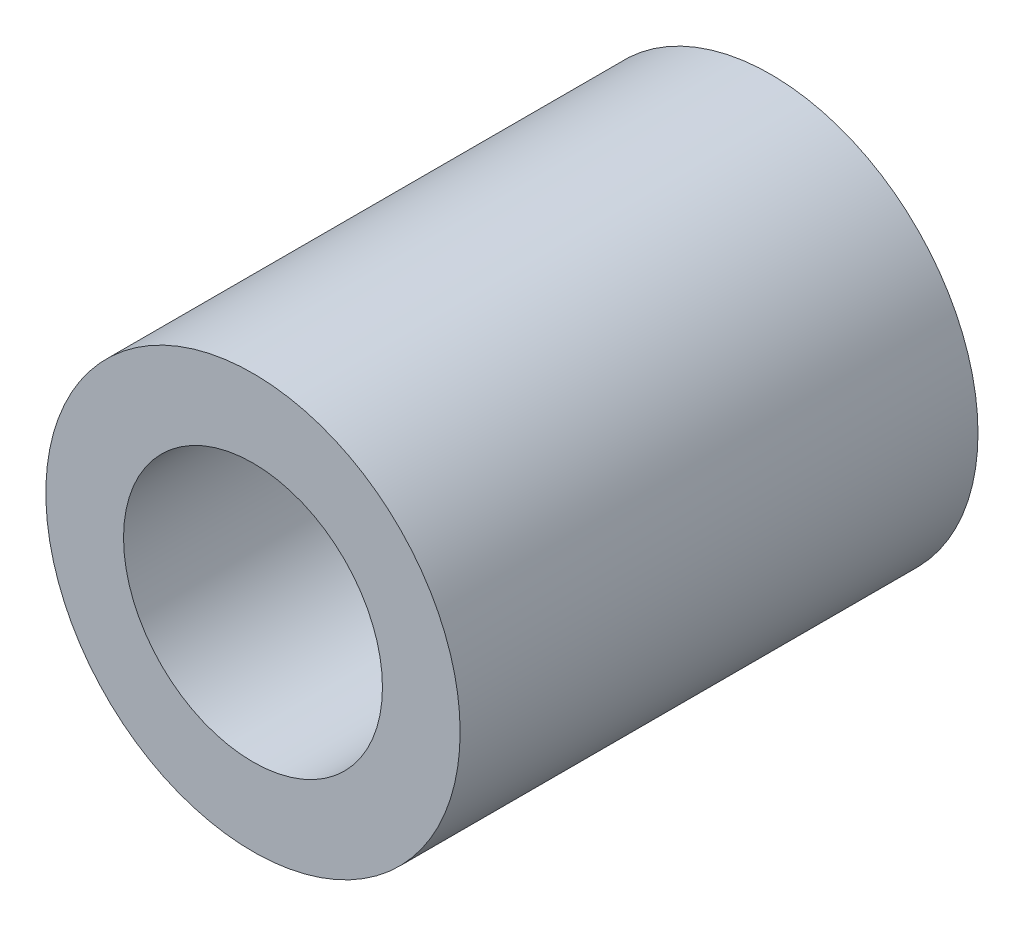
ISO-10303-21;
HEADER;
FILE_DESCRIPTION(('STEP AP214'),'2;1');
FILE_NAME('part.step','',(''),(''),'','','');
FILE_SCHEMA(('AUTOMOTIVE_DESIGN { 1 0 10303 214 1 1 1 1 }'));
ENDSEC;
DATA;
#1=APPLICATION_CONTEXT('core data for automotive mechanical design processes');
#2=APPLICATION_PROTOCOL_DEFINITION('international standard','automotive_design',2000,#1);
#3=PRODUCT_CONTEXT('',#1,'mechanical');
#4=PRODUCT('Part','Part','',(#3));
#5=PRODUCT_RELATED_PRODUCT_CATEGORY('part','',(#4));
#6=PRODUCT_DEFINITION_FORMATION('','',#4);
#7=PRODUCT_DEFINITION_CONTEXT('part definition',#1,'design');
#8=PRODUCT_DEFINITION('design','',#6,#7);
#9=PRODUCT_DEFINITION_SHAPE('','',#8);
#10=(LENGTH_UNIT() NAMED_UNIT(*) SI_UNIT(.MILLI.,.METRE.));
#11=(NAMED_UNIT(*) PLANE_ANGLE_UNIT() SI_UNIT($,.RADIAN.));
#12=(NAMED_UNIT(*) SI_UNIT($,.STERADIAN.) SOLID_ANGLE_UNIT());
#13=UNCERTAINTY_MEASURE_WITH_UNIT(LENGTH_MEASURE(1.E-05),#10,'distance_accuracy_value','');
#14=(GEOMETRIC_REPRESENTATION_CONTEXT(3) GLOBAL_UNCERTAINTY_ASSIGNED_CONTEXT((#13)) GLOBAL_UNIT_ASSIGNED_CONTEXT((#10,
#11,#12)) REPRESENTATION_CONTEXT('',''));
#15=CARTESIAN_POINT('',(0.,0.,0.));
#16=DIRECTION('',(0.,0.,1.));
#17=DIRECTION('',(1.,0.,0.));
#18=AXIS2_PLACEMENT_3D('',#15,#16,#17);
#19=CARTESIAN_POINT('',(0.,0.,5.));
#20=DIRECTION('',(0.,0.,1.));
#21=DIRECTION('',(1.,0.,0.));
#22=AXIS2_PLACEMENT_3D('',#19,#20,#21);
#23=PLANE('',#22);
#24=CARTESIAN_POINT('',(0.,0.,5.));
#25=DIRECTION('',(0.,0.,1.));
#26=DIRECTION('',(1.,0.,0.));
#27=AXIS2_PLACEMENT_3D('',#24,#25,#26);
#28=CIRCLE('',#27,2.);
#29=CARTESIAN_POINT('',(2.,0.,5.));
#30=VERTEX_POINT('',#29);
#31=EDGE_CURVE('E10',#30,#30,#28,.T.);
#32=ORIENTED_EDGE('',*,*,#31,.T.);
#33=EDGE_LOOP('',(#32));
#34=FACE_BOUND('',#33,.T.);
#35=CARTESIAN_POINT('',(0.,0.,5.));
#36=DIRECTION('',(0.,0.,1.));
#37=DIRECTION('',(1.,0.,0.));
#38=AXIS2_PLACEMENT_3D('',#35,#36,#37);
#39=CIRCLE('',#38,1.25);
#40=CARTESIAN_POINT('',(1.25,0.,5.));
#41=VERTEX_POINT('',#40);
#42=EDGE_CURVE('E50',#41,#41,#39,.T.);
#43=ORIENTED_EDGE('',*,*,#42,.F.);
#44=EDGE_LOOP('',(#43));
#45=FACE_BOUND('',#44,.T.);
#46=ADVANCED_FACE('F39',(#34,#45),#23,.T.);
#47=CARTESIAN_POINT('',(0.,0.,0.));
#48=DIRECTION('',(0.,0.,1.));
#49=DIRECTION('',(1.,0.,0.));
#50=AXIS2_PLACEMENT_3D('',#47,#48,#49);
#51=PLANE('',#50);
#52=CARTESIAN_POINT('',(0.,0.,0.));
#53=DIRECTION('',(0.,0.,1.));
#54=DIRECTION('',(1.,0.,0.));
#55=AXIS2_PLACEMENT_3D('',#52,#53,#54);
#56=CIRCLE('',#55,2.);
#57=CARTESIAN_POINT('',(2.,0.,0.));
#58=VERTEX_POINT('',#57);
#59=EDGE_CURVE('E43',#58,#58,#56,.T.);
#60=ORIENTED_EDGE('',*,*,#59,.F.);
#61=EDGE_LOOP('',(#60));
#62=FACE_BOUND('',#61,.T.);
#63=CARTESIAN_POINT('',(0.,0.,0.));
#64=DIRECTION('',(0.,0.,1.));
#65=DIRECTION('',(1.,0.,0.));
#66=AXIS2_PLACEMENT_3D('',#63,#64,#65);
#67=CIRCLE('',#66,1.25);
#68=CARTESIAN_POINT('',(1.25,0.,0.));
#69=VERTEX_POINT('',#68);
#70=EDGE_CURVE('E52',#69,#69,#67,.T.);
#71=ORIENTED_EDGE('',*,*,#70,.T.);
#72=EDGE_LOOP('',(#71));
#73=FACE_BOUND('',#72,.T.);
#74=ADVANCED_FACE('F62',(#62,#73),#51,.F.);
#75=CARTESIAN_POINT('',(0.,0.,5.));
#76=DIRECTION('',(0.,0.,-1.));
#77=DIRECTION('',(-1.,0.,0.));
#78=AXIS2_PLACEMENT_3D('',#75,#76,#77);
#79=CYLINDRICAL_SURFACE('',#78,2.);
#80=ORIENTED_EDGE('',*,*,#31,.F.);
#81=EDGE_LOOP('',(#80));
#82=FACE_BOUND('',#81,.T.);
#83=ORIENTED_EDGE('',*,*,#59,.T.);
#84=EDGE_LOOP('',(#83));
#85=FACE_BOUND('',#84,.T.);
#86=ADVANCED_FACE('F41',(#82,#85),#79,.T.);
#87=CARTESIAN_POINT('',(0.,0.,5.));
#88=DIRECTION('',(0.,0.,-1.));
#89=DIRECTION('',(-1.,0.,0.));
#90=AXIS2_PLACEMENT_3D('',#87,#88,#89);
#91=CYLINDRICAL_SURFACE('',#90,1.25);
#92=ORIENTED_EDGE('',*,*,#42,.T.);
#93=EDGE_LOOP('',(#92));
#94=FACE_BOUND('',#93,.T.);
#95=ORIENTED_EDGE('',*,*,#70,.F.);
#96=EDGE_LOOP('',(#95));
#97=FACE_BOUND('',#96,.T.);
#98=ADVANCED_FACE('F58',(#94,#97),#91,.F.);
#99=CLOSED_SHELL('',(#46,#74,#86,#98));
#100=MANIFOLD_SOLID_BREP('B2',#99);
#101=ADVANCED_BREP_SHAPE_REPRESENTATION('',(#18,#100),#14);
#102=SHAPE_DEFINITION_REPRESENTATION(#9,#101);
ENDSEC;
END-ISO-10303-21;
